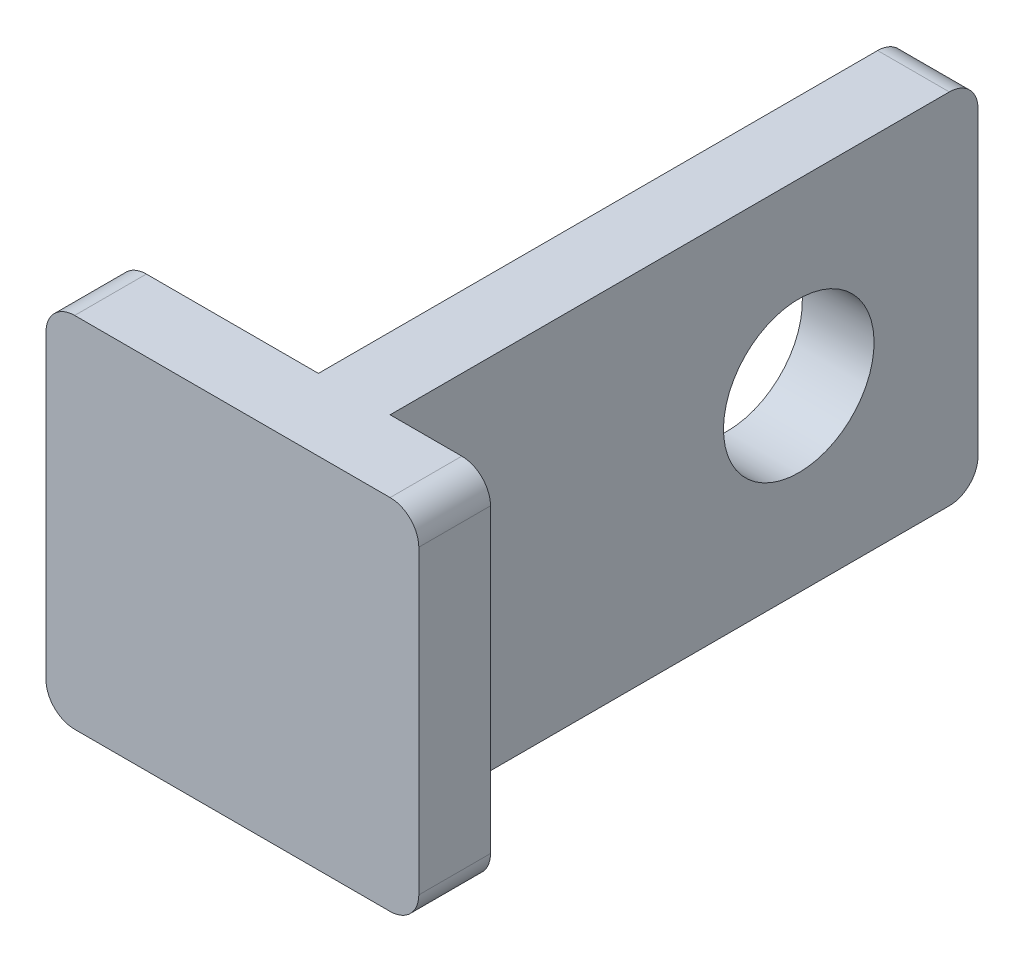
ISO-10303-21;
HEADER;
FILE_DESCRIPTION(('STEP AP214'),'2;1');
FILE_NAME('part.step','',(''),(''),'','','');
FILE_SCHEMA(('AUTOMOTIVE_DESIGN { 1 0 10303 214 1 1 1 1 }'));
ENDSEC;
DATA;
#1=APPLICATION_CONTEXT('core data for automotive mechanical design processes');
#2=APPLICATION_PROTOCOL_DEFINITION('international standard','automotive_design',2000,#1);
#3=PRODUCT_CONTEXT('',#1,'mechanical');
#4=PRODUCT('Part','Part','',(#3));
#5=PRODUCT_RELATED_PRODUCT_CATEGORY('part','',(#4));
#6=PRODUCT_DEFINITION_FORMATION('','',#4);
#7=PRODUCT_DEFINITION_CONTEXT('part definition',#1,'design');
#8=PRODUCT_DEFINITION('design','',#6,#7);
#9=PRODUCT_DEFINITION_SHAPE('','',#8);
#10=(LENGTH_UNIT() NAMED_UNIT(*) SI_UNIT(.MILLI.,.METRE.));
#11=(NAMED_UNIT(*) PLANE_ANGLE_UNIT() SI_UNIT($,.RADIAN.));
#12=(NAMED_UNIT(*) SI_UNIT($,.STERADIAN.) SOLID_ANGLE_UNIT());
#13=UNCERTAINTY_MEASURE_WITH_UNIT(LENGTH_MEASURE(1.E-05),#10,'distance_accuracy_value','');
#14=(GEOMETRIC_REPRESENTATION_CONTEXT(3) GLOBAL_UNCERTAINTY_ASSIGNED_CONTEXT((#13)) GLOBAL_UNIT_ASSIGNED_CONTEXT((#10,
#11,#12)) REPRESENTATION_CONTEXT('',''));
#15=CARTESIAN_POINT('',(0.,0.,0.));
#16=DIRECTION('',(0.,0.,1.));
#17=DIRECTION('',(1.,0.,0.));
#18=AXIS2_PLACEMENT_3D('',#15,#16,#17);
#19=CARTESIAN_POINT('',(-15.7541886883975,20.3843840342456,0.));
#20=DIRECTION('',(0.,0.,1.));
#21=DIRECTION('',(1.,0.,0.));
#22=AXIS2_PLACEMENT_3D('',#19,#20,#21);
#23=PLANE('',#22);
#24=DIRECTION('',(-1.,0.,0.));
#25=VECTOR('',#24,1.);
#26=CARTESIAN_POINT('',(-14.5041886883975,30.8843840342456,0.));
#27=LINE('',#26,#25);
#28=CARTESIAN_POINT('',(-13.2541886883975,30.8843840342456,0.));
#29=VERTEX_POINT('',#28);
#30=CARTESIAN_POINT('',(-18.2541886883975,30.8843840342456,0.));
#31=VERTEX_POINT('',#30);
#32=EDGE_CURVE('E192',#29,#31,#27,.T.);
#33=ORIENTED_EDGE('',*,*,#32,.F.);
#34=DIRECTION('',(0.,-1.,0.));
#35=VECTOR('',#34,1.);
#36=CARTESIAN_POINT('',(-13.2541886883975,32.8843840342456,0.));
#37=LINE('',#36,#35);
#38=CARTESIAN_POINT('',(-13.2541886883975,9.88438403424557,0.));
#39=VERTEX_POINT('',#38);
#40=EDGE_CURVE('E187',#29,#39,#37,.T.);
#41=ORIENTED_EDGE('',*,*,#40,.T.);
#42=DIRECTION('',(1.,0.,0.));
#43=VECTOR('',#42,1.);
#44=CARTESIAN_POINT('',(-17.0041886883975,9.88438403424557,0.));
#45=LINE('',#44,#43);
#46=CARTESIAN_POINT('',(-18.2541886883975,9.88438403424557,0.));
#47=VERTEX_POINT('',#46);
#48=EDGE_CURVE('E219',#47,#39,#45,.T.);
#49=ORIENTED_EDGE('',*,*,#48,.F.);
#50=DIRECTION('',(0.,1.,0.));
#51=VECTOR('',#50,1.);
#52=CARTESIAN_POINT('',(-18.2541886883975,7.88438403424557,0.));
#53=LINE('',#52,#51);
#54=EDGE_CURVE('E173',#47,#31,#53,.T.);
#55=ORIENTED_EDGE('',*,*,#54,.T.);
#56=EDGE_LOOP('',(#33,#41,#49,#55));
#57=FACE_BOUND('',#56,.T.);
#58=ADVANCED_FACE('F17',(#57),#23,.F.);
#59=CARTESIAN_POINT('',(-13.2541886883975,20.3843840342456,12.5));
#60=DIRECTION('',(-1.,0.,0.));
#61=DIRECTION('',(0.,1.,0.));
#62=AXIS2_PLACEMENT_3D('',#59,#60,#61);
#63=CYLINDRICAL_SURFACE('',#62,5.25);
#64=CARTESIAN_POINT('',(-13.2541886883975,20.3843840342456,12.5));
#65=DIRECTION('',(-1.,0.,0.));
#66=DIRECTION('',(0.,1.,0.));
#67=AXIS2_PLACEMENT_3D('',#64,#65,#66);
#68=CIRCLE('',#67,5.25);
#69=CARTESIAN_POINT('',(-13.2541886883975,15.1343840342456,12.5));
#70=VERTEX_POINT('',#69);
#71=EDGE_CURVE('E21',#70,#70,#68,.T.);
#72=ORIENTED_EDGE('',*,*,#71,.F.);
#73=DIRECTION('',(-1.,0.,0.));
#74=VECTOR('',#73,1.);
#75=CARTESIAN_POINT('',(-13.2541886883975,15.1343840342456,12.5));
#76=LINE('',#75,#74);
#77=CARTESIAN_POINT('',(-18.2541886883975,15.1343840342456,12.5));
#78=VERTEX_POINT('',#77);
#79=EDGE_CURVE('E11',#70,#78,#76,.T.);
#80=ORIENTED_EDGE('',*,*,#79,.T.);
#81=CARTESIAN_POINT('',(-18.2541886883975,20.3843840342456,12.5));
#82=DIRECTION('',(1.,0.,0.));
#83=DIRECTION('',(0.,1.,0.));
#84=AXIS2_PLACEMENT_3D('',#81,#82,#83);
#85=CIRCLE('',#84,5.25);
#86=EDGE_CURVE('E199',#78,#78,#85,.T.);
#87=ORIENTED_EDGE('',*,*,#86,.F.);
#88=ORIENTED_EDGE('',*,*,#79,.F.);
#89=EDGE_LOOP('',(#72,#80,#87,#88));
#90=FACE_BOUND('',#89,.T.);
#91=ADVANCED_FACE('F333',(#90),#63,.F.);
#92=CARTESIAN_POINT('',(-13.2541886883975,7.88438403424557,0.));
#93=DIRECTION('',(1.,0.,0.));
#94=DIRECTION('',(0.,1.,0.));
#95=AXIS2_PLACEMENT_3D('',#92,#93,#94);
#96=PLANE('',#95);
#97=ORIENTED_EDGE('',*,*,#71,.T.);
#98=EDGE_LOOP('',(#97));
#99=FACE_BOUND('',#98,.T.);
#100=CARTESIAN_POINT('',(-13.2541886883975,30.8843840342456,2.));
#101=DIRECTION('',(-1.,0.,0.));
#102=DIRECTION('',(0.,0.707106781186548,-0.707106781186547));
#103=AXIS2_PLACEMENT_3D('',#100,#101,#102);
#104=CIRCLE('',#103,2.);
#105=CARTESIAN_POINT('',(-13.2541886883975,32.8843840342456,2.));
#106=VERTEX_POINT('',#105);
#107=EDGE_CURVE('E179',#106,#29,#104,.T.);
#108=ORIENTED_EDGE('',*,*,#107,.F.);
#109=DIRECTION('',(0.,0.,1.));
#110=VECTOR('',#109,1.);
#111=CARTESIAN_POINT('',(-13.2541886883975,32.8843840342456,0.));
#112=LINE('',#111,#110);
#113=CARTESIAN_POINT('',(-13.2541886883975,32.8843840342456,41.));
#114=VERTEX_POINT('',#113);
#115=EDGE_CURVE('E165',#106,#114,#112,.T.);
#116=ORIENTED_EDGE('',*,*,#115,.T.);
#117=DIRECTION('',(0.,-1.,0.));
#118=VECTOR('',#117,1.);
#119=CARTESIAN_POINT('',(-13.2541886883975,7.88438403424557,41.));
#120=LINE('',#119,#118);
#121=CARTESIAN_POINT('',(-13.2541886883975,7.88438403424557,41.));
#122=VERTEX_POINT('',#121);
#123=EDGE_CURVE('E223',#114,#122,#120,.T.);
#124=ORIENTED_EDGE('',*,*,#123,.T.);
#125=DIRECTION('',(0.,0.,1.));
#126=VECTOR('',#125,1.);
#127=CARTESIAN_POINT('',(-13.2541886883975,7.88438403424557,0.));
#128=LINE('',#127,#126);
#129=CARTESIAN_POINT('',(-13.2541886883975,7.88438403424557,2.));
#130=VERTEX_POINT('',#129);
#131=EDGE_CURVE('E262',#130,#122,#128,.T.);
#132=ORIENTED_EDGE('',*,*,#131,.F.);
#133=CARTESIAN_POINT('',(-13.2541886883975,9.88438403424557,2.));
#134=DIRECTION('',(-1.,0.,0.));
#135=DIRECTION('',(0.,-0.707106781186547,-0.707106781186548));
#136=AXIS2_PLACEMENT_3D('',#133,#134,#135);
#137=CIRCLE('',#136,2.);
#138=EDGE_CURVE('E216',#39,#130,#137,.T.);
#139=ORIENTED_EDGE('',*,*,#138,.F.);
#140=ORIENTED_EDGE('',*,*,#40,.F.);
#141=EDGE_LOOP('',(#108,#116,#124,#132,#139,#140));
#142=FACE_BOUND('',#141,.T.);
#143=ADVANCED_FACE('F186',(#99,#142),#96,.T.);
#144=CARTESIAN_POINT('',(-13.2541886883975,7.88438403424557,41.));
#145=DIRECTION('',(0.,0.,-1.));
#146=DIRECTION('',(0.,-1.,0.));
#147=AXIS2_PLACEMENT_3D('',#144,#145,#146);
#148=PLANE('',#147);
#149=CARTESIAN_POINT('',(-8.25418868839755,9.88438403424557,41.));
#150=DIRECTION('',(0.,0.,1.));
#151=DIRECTION('',(0.707106781186548,-0.707106781186547,0.));
#152=AXIS2_PLACEMENT_3D('',#149,#150,#151);
#153=CIRCLE('',#152,2.);
#154=CARTESIAN_POINT('',(-8.25418868839755,7.88438403424557,41.));
#155=VERTEX_POINT('',#154);
#156=CARTESIAN_POINT('',(-6.25418868839755,9.88438403424557,41.));
#157=VERTEX_POINT('',#156);
#158=EDGE_CURVE('E283',#155,#157,#153,.T.);
#159=ORIENTED_EDGE('',*,*,#158,.F.);
#160=DIRECTION('',(1.,0.,0.));
#161=VECTOR('',#160,1.);
#162=CARTESIAN_POINT('',(-13.2541886883975,7.88438403424557,41.));
#163=LINE('',#162,#161);
#164=EDGE_CURVE('E257',#122,#155,#163,.T.);
#165=ORIENTED_EDGE('',*,*,#164,.F.);
#166=ORIENTED_EDGE('',*,*,#123,.F.);
#167=DIRECTION('',(1.,0.,0.));
#168=VECTOR('',#167,1.);
#169=CARTESIAN_POINT('',(-13.2541886883975,32.8843840342456,41.));
#170=LINE('',#169,#168);
#171=CARTESIAN_POINT('',(-8.25418868839755,32.8843840342456,41.));
#172=VERTEX_POINT('',#171);
#173=EDGE_CURVE('E168',#114,#172,#170,.T.);
#174=ORIENTED_EDGE('',*,*,#173,.T.);
#175=CARTESIAN_POINT('',(-8.25418868839755,30.8843840342456,41.));
#176=DIRECTION('',(0.,0.,1.));
#177=DIRECTION('',(0.707106781186548,0.707106781186548,0.));
#178=AXIS2_PLACEMENT_3D('',#175,#176,#177);
#179=CIRCLE('',#178,2.);
#180=CARTESIAN_POINT('',(-6.25418868839755,30.8843840342456,41.));
#181=VERTEX_POINT('',#180);
#182=EDGE_CURVE('E316',#181,#172,#179,.T.);
#183=ORIENTED_EDGE('',*,*,#182,.F.);
#184=DIRECTION('',(0.,1.,0.));
#185=VECTOR('',#184,1.);
#186=CARTESIAN_POINT('',(-6.25418868839755,32.8843840342456,41.));
#187=LINE('',#186,#185);
#188=EDGE_CURVE('E229',#157,#181,#187,.T.);
#189=ORIENTED_EDGE('',*,*,#188,.F.);
#190=EDGE_LOOP('',(#159,#165,#166,#174,#183,#189));
#191=FACE_BOUND('',#190,.T.);
#192=ADVANCED_FACE('F366',(#191),#148,.T.);
#193=CARTESIAN_POINT('',(-6.25418868839755,20.3843840342456,43.5));
#194=DIRECTION('',(1.,0.,0.));
#195=DIRECTION('',(0.,1.,0.));
#196=AXIS2_PLACEMENT_3D('',#193,#194,#195);
#197=PLANE('',#196);
#198=DIRECTION('',(0.,0.,1.));
#199=VECTOR('',#198,1.);
#200=CARTESIAN_POINT('',(-6.25418868839755,9.88438403424557,21.75));
#201=LINE('',#200,#199);
#202=CARTESIAN_POINT('',(-6.25418868839755,9.88438403424557,46.));
#203=VERTEX_POINT('',#202);
#204=EDGE_CURVE('E278',#157,#203,#201,.T.);
#205=ORIENTED_EDGE('',*,*,#204,.F.);
#206=ORIENTED_EDGE('',*,*,#188,.T.);
#207=DIRECTION('',(0.,0.,-1.));
#208=VECTOR('',#207,1.);
#209=CARTESIAN_POINT('',(-6.25418868839755,30.8843840342456,21.75));
#210=LINE('',#209,#208);
#211=CARTESIAN_POINT('',(-6.25418868839755,30.8843840342456,46.));
#212=VERTEX_POINT('',#211);
#213=EDGE_CURVE('E284',#212,#181,#210,.T.);
#214=ORIENTED_EDGE('',*,*,#213,.F.);
#215=DIRECTION('',(0.,-1.,0.));
#216=VECTOR('',#215,1.);
#217=CARTESIAN_POINT('',(-6.25418868839755,7.88438403424557,46.));
#218=LINE('',#217,#216);
#219=EDGE_CURVE('E240',#212,#203,#218,.T.);
#220=ORIENTED_EDGE('',*,*,#219,.T.);
#221=EDGE_LOOP('',(#205,#206,#214,#220));
#222=FACE_BOUND('',#221,.T.);
#223=ADVANCED_FACE('F19',(#222),#197,.T.);
#224=CARTESIAN_POINT('',(-32.2541886883975,20.3843840342456,43.5));
#225=DIRECTION('',(1.,0.,0.));
#226=DIRECTION('',(0.,1.,0.));
#227=AXIS2_PLACEMENT_3D('',#224,#225,#226);
#228=PLANE('',#227);
#229=DIRECTION('',(0.,0.,1.));
#230=VECTOR('',#229,1.);
#231=CARTESIAN_POINT('',(-32.2541886883975,30.8843840342456,21.75));
#232=LINE('',#231,#230);
#233=CARTESIAN_POINT('',(-32.2541886883975,30.8843840342456,41.));
#234=VERTEX_POINT('',#233);
#235=CARTESIAN_POINT('',(-32.2541886883975,30.8843840342456,46.));
#236=VERTEX_POINT('',#235);
#237=EDGE_CURVE('E259',#234,#236,#232,.T.);
#238=ORIENTED_EDGE('',*,*,#237,.F.);
#239=DIRECTION('',(0.,1.,0.));
#240=VECTOR('',#239,1.);
#241=CARTESIAN_POINT('',(-32.2541886883975,26.6343840342456,41.));
#242=LINE('',#241,#240);
#243=CARTESIAN_POINT('',(-32.2541886883975,9.88438403424557,41.));
#244=VERTEX_POINT('',#243);
#245=EDGE_CURVE('E50',#244,#234,#242,.T.);
#246=ORIENTED_EDGE('',*,*,#245,.F.);
#247=DIRECTION('',(0.,0.,-1.));
#248=VECTOR('',#247,1.);
#249=CARTESIAN_POINT('',(-32.2541886883975,9.88438403424557,21.75));
#250=LINE('',#249,#248);
#251=CARTESIAN_POINT('',(-32.2541886883975,9.88438403424557,46.));
#252=VERTEX_POINT('',#251);
#253=EDGE_CURVE('E325',#252,#244,#250,.T.);
#254=ORIENTED_EDGE('',*,*,#253,.F.);
#255=DIRECTION('',(0.,-1.,0.));
#256=VECTOR('',#255,1.);
#257=CARTESIAN_POINT('',(-32.2541886883975,20.3843840342456,46.));
#258=LINE('',#257,#256);
#259=EDGE_CURVE('E254',#236,#252,#258,.T.);
#260=ORIENTED_EDGE('',*,*,#259,.F.);
#261=EDGE_LOOP('',(#238,#246,#254,#260));
#262=FACE_BOUND('',#261,.T.);
#263=ADVANCED_FACE('F380',(#262),#228,.F.);
#264=CARTESIAN_POINT('',(-18.2541886883975,32.8843840342456,41.));
#265=DIRECTION('',(0.,0.,-1.));
#266=DIRECTION('',(0.,-1.,0.));
#267=AXIS2_PLACEMENT_3D('',#264,#265,#266);
#268=PLANE('',#267);
#269=CARTESIAN_POINT('',(-30.2541886883975,30.8843840342456,41.));
#270=DIRECTION('',(0.,0.,1.));
#271=DIRECTION('',(-0.707106781186548,0.707106781186548,0.));
#272=AXIS2_PLACEMENT_3D('',#269,#270,#271);
#273=CIRCLE('',#272,2.);
#274=CARTESIAN_POINT('',(-30.2541886883975,32.8843840342456,41.));
#275=VERTEX_POINT('',#274);
#276=EDGE_CURVE('E241',#275,#234,#273,.T.);
#277=ORIENTED_EDGE('',*,*,#276,.F.);
#278=DIRECTION('',(-1.,0.,0.));
#279=VECTOR('',#278,1.);
#280=CARTESIAN_POINT('',(-18.2541886883975,32.8843840342456,41.));
#281=LINE('',#280,#279);
#282=CARTESIAN_POINT('',(-18.2541886883975,32.8843840342456,41.));
#283=VERTEX_POINT('',#282);
#284=EDGE_CURVE('E206',#283,#275,#281,.T.);
#285=ORIENTED_EDGE('',*,*,#284,.F.);
#286=DIRECTION('',(0.,1.,0.));
#287=VECTOR('',#286,1.);
#288=CARTESIAN_POINT('',(-18.2541886883975,32.8843840342456,41.));
#289=LINE('',#288,#287);
#290=CARTESIAN_POINT('',(-18.2541886883975,7.88438403424557,41.));
#291=VERTEX_POINT('',#290);
#292=EDGE_CURVE('E196',#291,#283,#289,.T.);
#293=ORIENTED_EDGE('',*,*,#292,.F.);
#294=DIRECTION('',(-1.,0.,0.));
#295=VECTOR('',#294,1.);
#296=CARTESIAN_POINT('',(-18.2541886883975,7.88438403424557,41.));
#297=LINE('',#296,#295);
#298=CARTESIAN_POINT('',(-30.2541886883975,7.88438403424557,41.));
#299=VERTEX_POINT('',#298);
#300=EDGE_CURVE('E245',#291,#299,#297,.T.);
#301=ORIENTED_EDGE('',*,*,#300,.T.);
#302=CARTESIAN_POINT('',(-30.2541886883975,9.88438403424557,41.));
#303=DIRECTION('',(0.,0.,1.));
#304=DIRECTION('',(-0.707106781186548,-0.707106781186547,0.));
#305=AXIS2_PLACEMENT_3D('',#302,#303,#304);
#306=CIRCLE('',#305,2.);
#307=EDGE_CURVE('E317',#244,#299,#306,.T.);
#308=ORIENTED_EDGE('',*,*,#307,.F.);
#309=ORIENTED_EDGE('',*,*,#245,.T.);
#310=EDGE_LOOP('',(#277,#285,#293,#301,#308,#309));
#311=FACE_BOUND('',#310,.T.);
#312=ADVANCED_FACE('F353',(#311),#268,.T.);
#313=CARTESIAN_POINT('',(-30.2541886883975,9.88438403424557,21.75));
#314=DIRECTION('',(0.,0.,-1.));
#315=DIRECTION('',(-0.707106781186548,-0.707106781186547,0.));
#316=AXIS2_PLACEMENT_3D('',#313,#314,#315);
#317=CYLINDRICAL_SURFACE('',#316,2.);
#318=ORIENTED_EDGE('',*,*,#307,.T.);
#319=DIRECTION('',(0.,0.,1.));
#320=VECTOR('',#319,1.);
#321=CARTESIAN_POINT('',(-30.2541886883975,7.88438403424557,21.75));
#322=LINE('',#321,#320);
#323=CARTESIAN_POINT('',(-30.2541886883975,7.88438403424557,46.));
#324=VERTEX_POINT('',#323);
#325=EDGE_CURVE('E250',#299,#324,#322,.T.);
#326=ORIENTED_EDGE('',*,*,#325,.T.);
#327=CARTESIAN_POINT('',(-30.2541886883975,9.88438403424557,46.));
#328=DIRECTION('',(0.,0.,-1.));
#329=DIRECTION('',(-0.707106781186548,-0.707106781186547,0.));
#330=AXIS2_PLACEMENT_3D('',#327,#328,#329);
#331=CIRCLE('',#330,2.);
#332=EDGE_CURVE('E236',#324,#252,#331,.T.);
#333=ORIENTED_EDGE('',*,*,#332,.T.);
#334=ORIENTED_EDGE('',*,*,#253,.T.);
#335=EDGE_LOOP('',(#318,#326,#333,#334));
#336=FACE_BOUND('',#335,.T.);
#337=ADVANCED_FACE('F376',(#336),#317,.T.);
#338=CARTESIAN_POINT('',(-8.25418868839755,30.8843840342456,21.75));
#339=DIRECTION('',(0.,0.,1.));
#340=DIRECTION('',(0.707106781186548,0.707106781186548,0.));
#341=AXIS2_PLACEMENT_3D('',#338,#339,#340);
#342=CYLINDRICAL_SURFACE('',#341,2.);
#343=CARTESIAN_POINT('',(-8.25418868839755,30.8843840342456,46.));
#344=DIRECTION('',(0.,0.,-1.));
#345=DIRECTION('',(0.707106781186548,0.707106781186548,0.));
#346=AXIS2_PLACEMENT_3D('',#343,#344,#345);
#347=CIRCLE('',#346,2.);
#348=CARTESIAN_POINT('',(-8.25418868839755,32.8843840342456,46.));
#349=VERTEX_POINT('',#348);
#350=EDGE_CURVE('E308',#349,#212,#347,.T.);
#351=ORIENTED_EDGE('',*,*,#350,.T.);
#352=ORIENTED_EDGE('',*,*,#213,.T.);
#353=ORIENTED_EDGE('',*,*,#182,.T.);
#354=DIRECTION('',(0.,0.,1.));
#355=VECTOR('',#354,1.);
#356=CARTESIAN_POINT('',(-8.25418868839755,32.8843840342456,21.75));
#357=LINE('',#356,#355);
#358=EDGE_CURVE('E235',#172,#349,#357,.T.);
#359=ORIENTED_EDGE('',*,*,#358,.T.);
#360=EDGE_LOOP('',(#351,#352,#353,#359));
#361=FACE_BOUND('',#360,.T.);
#362=ADVANCED_FACE('F364',(#361),#342,.T.);
#363=CARTESIAN_POINT('',(-8.25418868839755,9.88438403424557,21.75));
#364=DIRECTION('',(0.,0.,-1.));
#365=DIRECTION('',(0.707106781186548,-0.707106781186547,0.));
#366=AXIS2_PLACEMENT_3D('',#363,#364,#365);
#367=CYLINDRICAL_SURFACE('',#366,2.);
#368=ORIENTED_EDGE('',*,*,#158,.T.);
#369=ORIENTED_EDGE('',*,*,#204,.T.);
#370=CARTESIAN_POINT('',(-8.25418868839755,9.88438403424557,46.));
#371=DIRECTION('',(0.,0.,-1.));
#372=DIRECTION('',(0.707106781186548,-0.707106781186547,0.));
#373=AXIS2_PLACEMENT_3D('',#370,#371,#372);
#374=CIRCLE('',#373,2.);
#375=CARTESIAN_POINT('',(-8.25418868839755,7.88438403424557,46.));
#376=VERTEX_POINT('',#375);
#377=EDGE_CURVE('E233',#203,#376,#374,.T.);
#378=ORIENTED_EDGE('',*,*,#377,.T.);
#379=DIRECTION('',(0.,0.,-1.));
#380=VECTOR('',#379,1.);
#381=CARTESIAN_POINT('',(-8.25418868839755,7.88438403424557,21.75));
#382=LINE('',#381,#380);
#383=EDGE_CURVE('E249',#376,#155,#382,.T.);
#384=ORIENTED_EDGE('',*,*,#383,.T.);
#385=EDGE_LOOP('',(#368,#369,#378,#384));
#386=FACE_BOUND('',#385,.T.);
#387=ADVANCED_FACE('F373',(#386),#367,.T.);
#388=CARTESIAN_POINT('',(-15.7541886883975,20.3843840342456,46.));
#389=DIRECTION('',(0.,0.,1.));
#390=DIRECTION('',(1.,0.,0.));
#391=AXIS2_PLACEMENT_3D('',#388,#389,#390);
#392=PLANE('',#391);
#393=CARTESIAN_POINT('',(-30.2541886883975,30.8843840342456,46.));
#394=DIRECTION('',(0.,0.,-1.));
#395=DIRECTION('',(-0.707106781186548,0.707106781186548,0.));
#396=AXIS2_PLACEMENT_3D('',#393,#394,#395);
#397=CIRCLE('',#396,2.);
#398=CARTESIAN_POINT('',(-30.2541886883975,32.8843840342456,46.));
#399=VERTEX_POINT('',#398);
#400=EDGE_CURVE('E238',#236,#399,#397,.T.);
#401=ORIENTED_EDGE('',*,*,#400,.F.);
#402=ORIENTED_EDGE('',*,*,#259,.T.);
#403=ORIENTED_EDGE('',*,*,#332,.F.);
#404=DIRECTION('',(-1.,0.,0.));
#405=VECTOR('',#404,1.);
#406=CARTESIAN_POINT('',(-18.2541886883975,7.88438403424557,46.));
#407=LINE('',#406,#405);
#408=EDGE_CURVE('E242',#376,#324,#407,.T.);
#409=ORIENTED_EDGE('',*,*,#408,.F.);
#410=ORIENTED_EDGE('',*,*,#377,.F.);
#411=ORIENTED_EDGE('',*,*,#219,.F.);
#412=ORIENTED_EDGE('',*,*,#350,.F.);
#413=DIRECTION('',(1.,0.,0.));
#414=VECTOR('',#413,1.);
#415=CARTESIAN_POINT('',(-13.2541886883975,32.8843840342456,46.));
#416=LINE('',#415,#414);
#417=EDGE_CURVE('E202',#399,#349,#416,.T.);
#418=ORIENTED_EDGE('',*,*,#417,.F.);
#419=EDGE_LOOP('',(#401,#402,#403,#409,#410,#411,#412,#418));
#420=FACE_BOUND('',#419,.T.);
#421=ADVANCED_FACE('F363',(#420),#392,.T.);
#422=CARTESIAN_POINT('',(-30.2541886883975,30.8843840342456,21.75));
#423=DIRECTION('',(0.,0.,1.));
#424=DIRECTION('',(-0.707106781186548,0.707106781186548,0.));
#425=AXIS2_PLACEMENT_3D('',#422,#423,#424);
#426=CYLINDRICAL_SURFACE('',#425,2.);
#427=ORIENTED_EDGE('',*,*,#400,.T.);
#428=DIRECTION('',(0.,0.,-1.));
#429=VECTOR('',#428,1.);
#430=CARTESIAN_POINT('',(-30.2541886883975,32.8843840342456,21.75));
#431=LINE('',#430,#429);
#432=EDGE_CURVE('E205',#399,#275,#431,.T.);
#433=ORIENTED_EDGE('',*,*,#432,.T.);
#434=ORIENTED_EDGE('',*,*,#276,.T.);
#435=ORIENTED_EDGE('',*,*,#237,.T.);
#436=EDGE_LOOP('',(#427,#433,#434,#435));
#437=FACE_BOUND('',#436,.T.);
#438=ADVANCED_FACE('F359',(#437),#426,.T.);
#439=CARTESIAN_POINT('',(-18.2541886883975,7.88438403424557,0.));
#440=DIRECTION('',(0.,-1.,0.));
#441=DIRECTION('',(0.,0.,-1.));
#442=AXIS2_PLACEMENT_3D('',#439,#440,#441);
#443=PLANE('',#442);
#444=DIRECTION('',(-1.,0.,0.));
#445=VECTOR('',#444,1.);
#446=CARTESIAN_POINT('',(-17.0041886883975,7.88438403424557,2.));
#447=LINE('',#446,#445);
#448=CARTESIAN_POINT('',(-18.2541886883975,7.88438403424557,2.));
#449=VERTEX_POINT('',#448);
#450=EDGE_CURVE('E218',#130,#449,#447,.T.);
#451=ORIENTED_EDGE('',*,*,#450,.F.);
#452=ORIENTED_EDGE('',*,*,#131,.T.);
#453=ORIENTED_EDGE('',*,*,#164,.T.);
#454=ORIENTED_EDGE('',*,*,#383,.F.);
#455=ORIENTED_EDGE('',*,*,#408,.T.);
#456=ORIENTED_EDGE('',*,*,#325,.F.);
#457=ORIENTED_EDGE('',*,*,#300,.F.);
#458=DIRECTION('',(0.,0.,1.));
#459=VECTOR('',#458,1.);
#460=CARTESIAN_POINT('',(-18.2541886883975,7.88438403424557,0.));
#461=LINE('',#460,#459);
#462=EDGE_CURVE('E203',#449,#291,#461,.T.);
#463=ORIENTED_EDGE('',*,*,#462,.F.);
#464=EDGE_LOOP('',(#451,#452,#453,#454,#455,#456,#457,#463));
#465=FACE_BOUND('',#464,.T.);
#466=ADVANCED_FACE('F349',(#465),#443,.T.);
#467=CARTESIAN_POINT('',(-17.0041886883975,9.88438403424557,2.));
#468=DIRECTION('',(-1.,0.,0.));
#469=DIRECTION('',(0.,-0.707106781186547,-0.707106781186548));
#470=AXIS2_PLACEMENT_3D('',#467,#468,#469);
#471=CYLINDRICAL_SURFACE('',#470,2.);
#472=CARTESIAN_POINT('',(-18.2541886883975,9.88438403424557,2.));
#473=DIRECTION('',(1.,0.,0.));
#474=DIRECTION('',(0.,-0.707106781186547,-0.707106781186548));
#475=AXIS2_PLACEMENT_3D('',#472,#473,#474);
#476=CIRCLE('',#475,2.);
#477=EDGE_CURVE('E214',#449,#47,#476,.T.);
#478=ORIENTED_EDGE('',*,*,#477,.T.);
#479=ORIENTED_EDGE('',*,*,#48,.T.);
#480=ORIENTED_EDGE('',*,*,#138,.T.);
#481=ORIENTED_EDGE('',*,*,#450,.T.);
#482=EDGE_LOOP('',(#478,#479,#480,#481));
#483=FACE_BOUND('',#482,.T.);
#484=ADVANCED_FACE('F340',(#483),#471,.T.);
#485=CARTESIAN_POINT('',(-18.2541886883975,32.8843840342456,0.));
#486=DIRECTION('',(-1.,0.,0.));
#487=DIRECTION('',(0.,0.,1.));
#488=AXIS2_PLACEMENT_3D('',#485,#486,#487);
#489=PLANE('',#488);
#490=ORIENTED_EDGE('',*,*,#86,.T.);
#491=EDGE_LOOP('',(#490));
#492=FACE_BOUND('',#491,.T.);
#493=CARTESIAN_POINT('',(-18.2541886883975,30.8843840342456,2.));
#494=DIRECTION('',(1.,0.,0.));
#495=DIRECTION('',(0.,0.707106781186548,-0.707106781186547));
#496=AXIS2_PLACEMENT_3D('',#493,#494,#495);
#497=CIRCLE('',#496,2.);
#498=CARTESIAN_POINT('',(-18.2541886883975,32.8843840342456,2.));
#499=VERTEX_POINT('',#498);
#500=EDGE_CURVE('E181',#31,#499,#497,.T.);
#501=ORIENTED_EDGE('',*,*,#500,.F.);
#502=ORIENTED_EDGE('',*,*,#54,.F.);
#503=ORIENTED_EDGE('',*,*,#477,.F.);
#504=ORIENTED_EDGE('',*,*,#462,.T.);
#505=ORIENTED_EDGE('',*,*,#292,.T.);
#506=DIRECTION('',(0.,0.,1.));
#507=VECTOR('',#506,1.);
#508=CARTESIAN_POINT('',(-18.2541886883975,32.8843840342456,0.));
#509=LINE('',#508,#507);
#510=EDGE_CURVE('E182',#499,#283,#509,.T.);
#511=ORIENTED_EDGE('',*,*,#510,.F.);
#512=EDGE_LOOP('',(#501,#502,#503,#504,#505,#511));
#513=FACE_BOUND('',#512,.T.);
#514=ADVANCED_FACE('F337',(#492,#513),#489,.T.);
#515=CARTESIAN_POINT('',(-13.2541886883975,32.8843840342456,0.));
#516=DIRECTION('',(0.,1.,0.));
#517=DIRECTION('',(1.,0.,0.));
#518=AXIS2_PLACEMENT_3D('',#515,#516,#517);
#519=PLANE('',#518);
#520=DIRECTION('',(1.,0.,0.));
#521=VECTOR('',#520,1.);
#522=CARTESIAN_POINT('',(-14.5041886883975,32.8843840342456,2.));
#523=LINE('',#522,#521);
#524=EDGE_CURVE('E167',#499,#106,#523,.T.);
#525=ORIENTED_EDGE('',*,*,#524,.F.);
#526=ORIENTED_EDGE('',*,*,#510,.T.);
#527=ORIENTED_EDGE('',*,*,#284,.T.);
#528=ORIENTED_EDGE('',*,*,#432,.F.);
#529=ORIENTED_EDGE('',*,*,#417,.T.);
#530=ORIENTED_EDGE('',*,*,#358,.F.);
#531=ORIENTED_EDGE('',*,*,#173,.F.);
#532=ORIENTED_EDGE('',*,*,#115,.F.);
#533=EDGE_LOOP('',(#525,#526,#527,#528,#529,#530,#531,#532));
#534=FACE_BOUND('',#533,.T.);
#535=ADVANCED_FACE('F163',(#534),#519,.T.);
#536=CARTESIAN_POINT('',(-14.5041886883975,30.8843840342456,2.));
#537=DIRECTION('',(1.,0.,0.));
#538=DIRECTION('',(0.,0.707106781186548,-0.707106781186547));
#539=AXIS2_PLACEMENT_3D('',#536,#537,#538);
#540=CYLINDRICAL_SURFACE('',#539,2.);
#541=ORIENTED_EDGE('',*,*,#107,.T.);
#542=ORIENTED_EDGE('',*,*,#32,.T.);
#543=ORIENTED_EDGE('',*,*,#500,.T.);
#544=ORIENTED_EDGE('',*,*,#524,.T.);
#545=EDGE_LOOP('',(#541,#542,#543,#544));
#546=FACE_BOUND('',#545,.T.);
#547=ADVANCED_FACE('F178',(#546),#540,.T.);
#548=CLOSED_SHELL('',(#58,#91,#143,#192,#223,#263,#312,#337,#362,#387,#421,#438,#466,#484,#514,
#535,#547));
#549=MANIFOLD_SOLID_BREP('B1',#548);
#550=ADVANCED_BREP_SHAPE_REPRESENTATION('',(#18,#549),#14);
#551=SHAPE_DEFINITION_REPRESENTATION(#9,#550);
ENDSEC;
END-ISO-10303-21;
